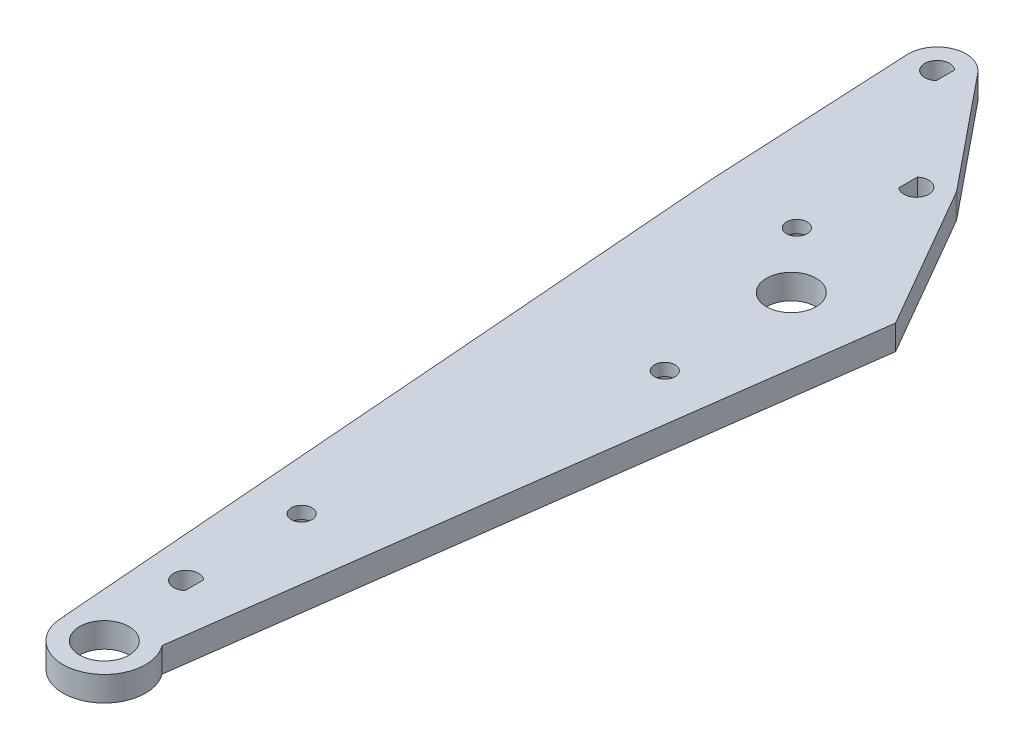
ISO-10303-21;
HEADER;
FILE_DESCRIPTION(('STEP AP214'),'2;1');
FILE_NAME('part.step','',(''),(''),'','','');
FILE_SCHEMA(('AUTOMOTIVE_DESIGN { 1 0 10303 214 1 1 1 1 }'));
ENDSEC;
DATA;
#1=APPLICATION_CONTEXT('core data for automotive mechanical design processes');
#2=APPLICATION_PROTOCOL_DEFINITION('international standard','automotive_design',2000,#1);
#3=PRODUCT_CONTEXT('',#1,'mechanical');
#4=PRODUCT('Part','Part','',(#3));
#5=PRODUCT_RELATED_PRODUCT_CATEGORY('part','',(#4));
#6=PRODUCT_DEFINITION_FORMATION('','',#4);
#7=PRODUCT_DEFINITION_CONTEXT('part definition',#1,'design');
#8=PRODUCT_DEFINITION('design','',#6,#7);
#9=PRODUCT_DEFINITION_SHAPE('','',#8);
#10=(LENGTH_UNIT() NAMED_UNIT(*) SI_UNIT(.MILLI.,.METRE.));
#11=(NAMED_UNIT(*) PLANE_ANGLE_UNIT() SI_UNIT($,.RADIAN.));
#12=(NAMED_UNIT(*) SI_UNIT($,.STERADIAN.) SOLID_ANGLE_UNIT());
#13=UNCERTAINTY_MEASURE_WITH_UNIT(LENGTH_MEASURE(1.E-05),#10,'distance_accuracy_value','');
#14=(GEOMETRIC_REPRESENTATION_CONTEXT(3) GLOBAL_UNCERTAINTY_ASSIGNED_CONTEXT((#13)) GLOBAL_UNIT_ASSIGNED_CONTEXT((#10,
#11,#12)) REPRESENTATION_CONTEXT('',''));
#15=CARTESIAN_POINT('',(0.,0.,0.));
#16=DIRECTION('',(0.,0.,1.));
#17=DIRECTION('',(1.,0.,0.));
#18=AXIS2_PLACEMENT_3D('',#15,#16,#17);
#19=CARTESIAN_POINT('',(-5.00000000000001,3.,75.));
#20=DIRECTION('',(0.,-1.,0.));
#21=DIRECTION('',(0.,0.,-1.));
#22=AXIS2_PLACEMENT_3D('',#19,#20,#21);
#23=CYLINDRICAL_SURFACE('',#22,1.25);
#24=CARTESIAN_POINT('',(-5.00000000000001,3.,75.));
#25=DIRECTION('',(0.,-1.,0.));
#26=DIRECTION('',(0.,0.,-1.));
#27=AXIS2_PLACEMENT_3D('',#24,#25,#26);
#28=CIRCLE('',#27,1.25);
#29=CARTESIAN_POINT('',(-5.00000000000001,3.,73.75));
#30=VERTEX_POINT('',#29);
#31=EDGE_CURVE('E389',#30,#30,#28,.T.);
#32=ORIENTED_EDGE('',*,*,#31,.F.);
#33=EDGE_LOOP('',(#32));
#34=FACE_BOUND('',#33,.T.);
#35=CARTESIAN_POINT('',(-5.00000000000001,1.5,75.));
#36=DIRECTION('',(0.,-1.,0.));
#37=DIRECTION('',(0.,0.,-1.));
#38=AXIS2_PLACEMENT_3D('',#35,#36,#37);
#39=CIRCLE('',#38,1.25);
#40=CARTESIAN_POINT('',(-5.00000000000001,1.5,73.75));
#41=VERTEX_POINT('',#40);
#42=EDGE_CURVE('E402',#41,#41,#39,.T.);
#43=ORIENTED_EDGE('',*,*,#42,.T.);
#44=EDGE_LOOP('',(#43));
#45=FACE_BOUND('',#44,.T.);
#46=ADVANCED_FACE('F40',(#34,#45),#23,.F.);
#47=CARTESIAN_POINT('',(2.,3.,38.));
#48=DIRECTION('',(0.,-1.,0.));
#49=DIRECTION('',(0.,0.,-1.));
#50=AXIS2_PLACEMENT_3D('',#47,#48,#49);
#51=CYLINDRICAL_SURFACE('',#50,1.25);
#52=CARTESIAN_POINT('',(2.,3.,38.));
#53=DIRECTION('',(0.,-1.,0.));
#54=DIRECTION('',(0.,0.,-1.));
#55=AXIS2_PLACEMENT_3D('',#52,#53,#54);
#56=CIRCLE('',#55,1.25);
#57=CARTESIAN_POINT('',(2.,3.,36.75));
#58=VERTEX_POINT('',#57);
#59=EDGE_CURVE('E392',#58,#58,#56,.T.);
#60=ORIENTED_EDGE('',*,*,#59,.F.);
#61=EDGE_LOOP('',(#60));
#62=FACE_BOUND('',#61,.T.);
#63=CARTESIAN_POINT('',(2.,1.5,38.));
#64=DIRECTION('',(0.,-1.,0.));
#65=DIRECTION('',(0.,0.,-1.));
#66=AXIS2_PLACEMENT_3D('',#63,#64,#65);
#67=CIRCLE('',#66,1.25);
#68=CARTESIAN_POINT('',(2.,1.5,36.75));
#69=VERTEX_POINT('',#68);
#70=EDGE_CURVE('E405',#69,#69,#67,.T.);
#71=ORIENTED_EDGE('',*,*,#70,.T.);
#72=EDGE_LOOP('',(#71));
#73=FACE_BOUND('',#72,.T.);
#74=ADVANCED_FACE('F321',(#62,#73),#51,.F.);
#75=CARTESIAN_POINT('',(-5.,3.,15.));
#76=DIRECTION('',(0.,-1.,0.));
#77=DIRECTION('',(0.,0.,-1.));
#78=AXIS2_PLACEMENT_3D('',#75,#76,#77);
#79=CYLINDRICAL_SURFACE('',#78,1.25);
#80=CARTESIAN_POINT('',(-5.,3.,15.));
#81=DIRECTION('',(0.,-1.,0.));
#82=DIRECTION('',(0.,0.,-1.));
#83=AXIS2_PLACEMENT_3D('',#80,#81,#82);
#84=CIRCLE('',#83,1.25);
#85=CARTESIAN_POINT('',(-5.,3.,13.75));
#86=VERTEX_POINT('',#85);
#87=EDGE_CURVE('E386',#86,#86,#84,.T.);
#88=ORIENTED_EDGE('',*,*,#87,.F.);
#89=EDGE_LOOP('',(#88));
#90=FACE_BOUND('',#89,.T.);
#91=CARTESIAN_POINT('',(-5.,1.5,15.));
#92=DIRECTION('',(0.,-1.,0.));
#93=DIRECTION('',(0.,0.,-1.));
#94=AXIS2_PLACEMENT_3D('',#91,#92,#93);
#95=CIRCLE('',#94,1.25);
#96=CARTESIAN_POINT('',(-5.,1.5,13.75));
#97=VERTEX_POINT('',#96);
#98=EDGE_CURVE('E414',#97,#97,#95,.T.);
#99=ORIENTED_EDGE('',*,*,#98,.T.);
#100=EDGE_LOOP('',(#99));
#101=FACE_BOUND('',#100,.T.);
#102=ADVANCED_FACE('F328',(#90,#101),#79,.F.);
#103=CARTESIAN_POINT('',(-5.00000000000001,3.,89.));
#104=DIRECTION('',(0.,-1.,0.));
#105=DIRECTION('',(0.,0.,-1.));
#106=AXIS2_PLACEMENT_3D('',#103,#104,#105);
#107=CYLINDRICAL_SURFACE('',#106,1.5);
#108=DIRECTION('',(0.,-1.,0.));
#109=VECTOR('',#108,1.);
#110=CARTESIAN_POINT('',(-4.00000000000001,35.5074876240748,90.1180339887499));
#111=LINE('',#110,#109);
#112=CARTESIAN_POINT('',(-4.00000000000001,3.,90.1180339887499));
#113=VERTEX_POINT('',#112);
#114=CARTESIAN_POINT('',(-4.00000000000001,0.,90.1180339887499));
#115=VERTEX_POINT('',#114);
#116=EDGE_CURVE('E151',#113,#115,#111,.T.);
#117=ORIENTED_EDGE('',*,*,#116,.T.);
#118=CARTESIAN_POINT('',(-5.00000000000001,0.,89.));
#119=DIRECTION('',(0.,-1.,0.));
#120=DIRECTION('',(0.,0.,-1.));
#121=AXIS2_PLACEMENT_3D('',#118,#119,#120);
#122=CIRCLE('',#121,1.5);
#123=CARTESIAN_POINT('',(-4.00000000000001,0.,87.8819660112501));
#124=VERTEX_POINT('',#123);
#125=EDGE_CURVE('E161',#115,#124,#122,.T.);
#126=ORIENTED_EDGE('',*,*,#125,.T.);
#127=DIRECTION('',(0.,-1.,0.));
#128=VECTOR('',#127,1.);
#129=CARTESIAN_POINT('',(-4.00000000000001,35.5074876240748,87.8819660112501));
#130=LINE('',#129,#128);
#131=CARTESIAN_POINT('',(-4.00000000000001,3.,87.8819660112501));
#132=VERTEX_POINT('',#131);
#133=EDGE_CURVE('E154',#132,#124,#130,.T.);
#134=ORIENTED_EDGE('',*,*,#133,.F.);
#135=CARTESIAN_POINT('',(-5.00000000000001,3.,89.));
#136=DIRECTION('',(0.,-1.,0.));
#137=DIRECTION('',(0.,0.,-1.));
#138=AXIS2_PLACEMENT_3D('',#135,#136,#137);
#139=CIRCLE('',#138,1.5);
#140=EDGE_CURVE('E162',#113,#132,#139,.T.);
#141=ORIENTED_EDGE('',*,*,#140,.F.);
#142=EDGE_LOOP('',(#117,#126,#134,#141));
#143=FACE_BOUND('',#142,.T.);
#144=ADVANCED_FACE('F160',(#143),#107,.F.);
#145=CARTESIAN_POINT('',(-13.,12.8994949366117,-10.));
#146=DIRECTION('',(0.,-1.,0.));
#147=DIRECTION('',(0.,0.,-1.));
#148=AXIS2_PLACEMENT_3D('',#145,#146,#147);
#149=CYLINDRICAL_SURFACE('',#148,3.5);
#150=CARTESIAN_POINT('',(-13.,0.,-10.));
#151=DIRECTION('',(0.,-1.,0.));
#152=DIRECTION('',(0.,0.,-1.));
#153=AXIS2_PLACEMENT_3D('',#150,#151,#152);
#154=CIRCLE('',#153,3.5);
#155=CARTESIAN_POINT('',(-16.4956537637557,0.,-9.82563038125682));
#156=VERTEX_POINT('',#155);
#157=CARTESIAN_POINT('',(-10.2846372796594,0.,-12.2083489980038));
#158=VERTEX_POINT('',#157);
#159=EDGE_CURVE('E64',#156,#158,#154,.T.);
#160=ORIENTED_EDGE('',*,*,#159,.F.);
#161=DIRECTION('',(0.,-1.,0.));
#162=VECTOR('',#161,1.);
#163=CARTESIAN_POINT('',(-16.4956537637557,35.5074876240748,-9.82563038125682));
#164=LINE('',#163,#162);
#165=CARTESIAN_POINT('',(-16.4956537637557,3.,-9.82563038125682));
#166=VERTEX_POINT('',#165);
#167=EDGE_CURVE('E240',#166,#156,#164,.T.);
#168=ORIENTED_EDGE('',*,*,#167,.F.);
#169=CARTESIAN_POINT('',(-13.,3.,-10.));
#170=DIRECTION('',(0.,1.,0.));
#171=DIRECTION('',(0.,0.,1.));
#172=AXIS2_PLACEMENT_3D('',#169,#170,#171);
#173=CIRCLE('',#172,3.5);
#174=CARTESIAN_POINT('',(-10.2846372796594,3.,-12.2083489980038));
#175=VERTEX_POINT('',#174);
#176=EDGE_CURVE('E44',#166,#175,#173,.F.);
#177=ORIENTED_EDGE('',*,*,#176,.T.);
#178=DIRECTION('',(0.,-1.,0.));
#179=VECTOR('',#178,1.);
#180=CARTESIAN_POINT('',(-10.2846372796594,35.5074876240748,-12.2083489980038));
#181=LINE('',#180,#179);
#182=EDGE_CURVE('E228',#175,#158,#181,.T.);
#183=ORIENTED_EDGE('',*,*,#182,.T.);
#184=EDGE_LOOP('',(#160,#168,#177,#183));
#185=FACE_BOUND('',#184,.T.);
#186=ADVANCED_FACE('F341',(#185),#149,.T.);
#187=CARTESIAN_POINT('',(-12.,12.8994949366117,0.));
#188=DIRECTION('',(-1.,0.,0.));
#189=DIRECTION('',(0.,0.,1.));
#190=AXIS2_PLACEMENT_3D('',#187,#188,#189);
#191=PLANE('',#190);
#192=DIRECTION('',(0.,-1.,0.));
#193=VECTOR('',#192,1.);
#194=CARTESIAN_POINT('',(-12.,12.8994949366117,-8.88196601125011));
#195=LINE('',#194,#193);
#196=CARTESIAN_POINT('',(-12.,3.,-8.88196601125011));
#197=VERTEX_POINT('',#196);
#198=CARTESIAN_POINT('',(-12.,0.,-8.88196601125011));
#199=VERTEX_POINT('',#198);
#200=EDGE_CURVE('E49',#197,#199,#195,.T.);
#201=ORIENTED_EDGE('',*,*,#200,.F.);
#202=DIRECTION('',(0.,0.,-1.));
#203=VECTOR('',#202,1.);
#204=CARTESIAN_POINT('',(-12.,3.,0.));
#205=LINE('',#204,#203);
#206=CARTESIAN_POINT('',(-12.,3.,-11.1180339887499));
#207=VERTEX_POINT('',#206);
#208=EDGE_CURVE('E256',#197,#207,#205,.T.);
#209=ORIENTED_EDGE('',*,*,#208,.T.);
#210=DIRECTION('',(0.,-1.,0.));
#211=VECTOR('',#210,1.);
#212=CARTESIAN_POINT('',(-12.,12.8994949366117,-11.1180339887499));
#213=LINE('',#212,#211);
#214=CARTESIAN_POINT('',(-12.,0.,-11.1180339887499));
#215=VERTEX_POINT('',#214);
#216=EDGE_CURVE('E11',#207,#215,#213,.T.);
#217=ORIENTED_EDGE('',*,*,#216,.T.);
#218=DIRECTION('',(0.,0.,-1.));
#219=VECTOR('',#218,1.);
#220=CARTESIAN_POINT('',(-12.,0.,0.));
#221=LINE('',#220,#219);
#222=EDGE_CURVE('E264',#199,#215,#221,.T.);
#223=ORIENTED_EDGE('',*,*,#222,.F.);
#224=EDGE_LOOP('',(#201,#209,#217,#223));
#225=FACE_BOUND('',#224,.T.);
#226=ADVANCED_FACE('F276',(#225),#191,.T.);
#227=CARTESIAN_POINT('',(-13.,12.8994949366117,-10.));
#228=DIRECTION('',(0.,-1.,0.));
#229=DIRECTION('',(0.,0.,-1.));
#230=AXIS2_PLACEMENT_3D('',#227,#228,#229);
#231=CYLINDRICAL_SURFACE('',#230,1.5);
#232=CARTESIAN_POINT('',(-13.,3.,-10.));
#233=DIRECTION('',(0.,1.,0.));
#234=DIRECTION('',(0.,0.,1.));
#235=AXIS2_PLACEMENT_3D('',#232,#233,#234);
#236=CIRCLE('',#235,1.5);
#237=EDGE_CURVE('E259',#197,#207,#236,.F.);
#238=ORIENTED_EDGE('',*,*,#237,.F.);
#239=ORIENTED_EDGE('',*,*,#200,.T.);
#240=CARTESIAN_POINT('',(-13.,0.,-10.));
#241=DIRECTION('',(0.,-1.,0.));
#242=DIRECTION('',(0.,0.,-1.));
#243=AXIS2_PLACEMENT_3D('',#240,#241,#242);
#244=CIRCLE('',#243,1.5);
#245=EDGE_CURVE('E261',#199,#215,#244,.T.);
#246=ORIENTED_EDGE('',*,*,#245,.T.);
#247=ORIENTED_EDGE('',*,*,#216,.F.);
#248=EDGE_LOOP('',(#238,#239,#246,#247));
#249=FACE_BOUND('',#248,.T.);
#250=ADVANCED_FACE('F42',(#249),#231,.F.);
#251=CARTESIAN_POINT('',(0.,0.,0.));
#252=DIRECTION('',(0.,-1.,0.));
#253=DIRECTION('',(0.,0.,-1.));
#254=AXIS2_PLACEMENT_3D('',#251,#252,#253);
#255=PLANE('',#254);
#256=CARTESIAN_POINT('',(-5.,0.,15.));
#257=DIRECTION('',(0.,-1.,0.));
#258=DIRECTION('',(0.,0.,-1.));
#259=AXIS2_PLACEMENT_3D('',#256,#257,#258);
#260=CIRCLE('',#259,2.00000000000001);
#261=CARTESIAN_POINT('',(-5.,0.,13.));
#262=VERTEX_POINT('',#261);
#263=EDGE_CURVE('E417',#262,#262,#260,.T.);
#264=ORIENTED_EDGE('',*,*,#263,.F.);
#265=EDGE_LOOP('',(#264));
#266=FACE_BOUND('',#265,.T.);
#267=CARTESIAN_POINT('',(2.,0.,38.));
#268=DIRECTION('',(0.,-1.,0.));
#269=DIRECTION('',(0.,0.,-1.));
#270=AXIS2_PLACEMENT_3D('',#267,#268,#269);
#271=CIRCLE('',#270,2.);
#272=CARTESIAN_POINT('',(2.,0.,36.));
#273=VERTEX_POINT('',#272);
#274=EDGE_CURVE('E408',#273,#273,#271,.T.);
#275=ORIENTED_EDGE('',*,*,#274,.F.);
#276=EDGE_LOOP('',(#275));
#277=FACE_BOUND('',#276,.T.);
#278=CARTESIAN_POINT('',(-5.00000000000001,0.,75.));
#279=DIRECTION('',(0.,-1.,0.));
#280=DIRECTION('',(0.,0.,-1.));
#281=AXIS2_PLACEMENT_3D('',#278,#279,#280);
#282=CIRCLE('',#281,2.);
#283=CARTESIAN_POINT('',(-5.00000000000001,0.,73.));
#284=VERTEX_POINT('',#283);
#285=EDGE_CURVE('E398',#284,#284,#282,.T.);
#286=ORIENTED_EDGE('',*,*,#285,.F.);
#287=EDGE_LOOP('',(#286));
#288=FACE_BOUND('',#287,.T.);
#289=ORIENTED_EDGE('',*,*,#245,.F.);
#290=ORIENTED_EDGE('',*,*,#222,.T.);
#291=EDGE_LOOP('',(#289,#290));
#292=FACE_BOUND('',#291,.T.);
#293=ORIENTED_EDGE('',*,*,#159,.T.);
#294=DIRECTION('',(-0.630956856572518,0.,-0.775817920097317));
#295=VECTOR('',#294,1.);
#296=CARTESIAN_POINT('',(-0.214175705160721,0.,0.174184723221474));
#297=LINE('',#296,#295);
#298=CARTESIAN_POINT('',(0.694636778176915,0.,1.29165100199619));
#299=VERTEX_POINT('',#298);
#300=EDGE_CURVE('E241',#299,#158,#297,.T.);
#301=ORIENTED_EDGE('',*,*,#300,.F.);
#302=CARTESIAN_POINT('',(-2.02072594216369,0.,3.5));
#303=DIRECTION('',(0.,1.,0.));
#304=DIRECTION('',(0.,0.,1.));
#305=AXIS2_PLACEMENT_3D('',#302,#303,#304);
#306=CIRCLE('',#305,3.5);
#307=CARTESIAN_POINT('',(1.01036297108185,0.,1.75000000000001));
#308=VERTEX_POINT('',#307);
#309=EDGE_CURVE('E208',#308,#299,#306,.T.);
#310=ORIENTED_EDGE('',*,*,#309,.F.);
#311=DIRECTION('',(0.499999999999998,0.,0.86602540378444));
#312=VECTOR('',#311,1.);
#313=CARTESIAN_POINT('',(0.,0.,0.));
#314=LINE('',#313,#312);
#315=CARTESIAN_POINT('',(10.9792740578363,0.,19.0166604983955));
#316=VERTEX_POINT('',#315);
#317=EDGE_CURVE('E205',#308,#316,#314,.T.);
#318=ORIENTED_EDGE('',*,*,#317,.T.);
#319=DIRECTION('',(0.134133468348585,0.,-0.990963275136258));
#320=VECTOR('',#319,1.);
#321=CARTESIAN_POINT('',(13.3094573106285,0.,1.80152354351028));
#322=LINE('',#321,#320);
#323=CARTESIAN_POINT('',(0.38428686699731,0.,97.2912577031378));
#324=VERTEX_POINT('',#323);
#325=EDGE_CURVE('E371',#324,#316,#322,.T.);
#326=ORIENTED_EDGE('',*,*,#325,.F.);
#327=CARTESIAN_POINT('',(-3.61571313300269,0.,100.291257703138));
#328=DIRECTION('',(0.,1.,0.));
#329=DIRECTION('',(0.,0.,1.));
#330=AXIS2_PLACEMENT_3D('',#327,#328,#329);
#331=CIRCLE('',#330,5.00000000000001);
#332=CARTESIAN_POINT('',(-8.61301010974704,0.,100.126871188418));
#333=VERTEX_POINT('',#332);
#334=EDGE_CURVE('E216',#333,#324,#331,.T.);
#335=ORIENTED_EDGE('',*,*,#334,.F.);
#336=DIRECTION('',(-0.999459395348868,0.,-0.0328773029440681));
#337=VECTOR('',#336,1.);
#338=CARTESIAN_POINT('',(-3.29943180912356,0.,100.301661804544));
#339=LINE('',#338,#337);
#340=CARTESIAN_POINT('',(-8.64369988169605,0.,100.125861645724));
#341=VERTEX_POINT('',#340);
#342=EDGE_CURVE('E213',#333,#341,#339,.T.);
#343=ORIENTED_EDGE('',*,*,#342,.T.);
#344=DIRECTION('',(-0.0775829185283547,0.,-0.996985902985906));
#345=VECTOR('',#344,1.);
#346=CARTESIAN_POINT('',(-16.3363153983453,0.,1.27125069954098));
#347=LINE('',#346,#345);
#348=CARTESIAN_POINT('',(-15.2382479566062,0.,15.3820598919224));
#349=VERTEX_POINT('',#348);
#350=EDGE_CURVE('E210',#341,#349,#347,.T.);
#351=ORIENTED_EDGE('',*,*,#350,.T.);
#352=DIRECTION('',(0.0498198910694797,0.,0.998758218215913));
#353=VECTOR('',#352,1.);
#354=CARTESIAN_POINT('',(-15.9658072272928,0.,0.796403736552868));
#355=LINE('',#354,#353);
#356=EDGE_CURVE('E236',#156,#349,#355,.T.);
#357=ORIENTED_EDGE('',*,*,#356,.F.);
#358=EDGE_LOOP('',(#293,#301,#310,#318,#326,#335,#343,#351,#357));
#359=FACE_BOUND('',#358,.T.);
#360=CARTESIAN_POINT('',(-2.02072594216369,0.,3.5));
#361=DIRECTION('',(0.,1.,0.));
#362=DIRECTION('',(0.,0.,1.));
#363=AXIS2_PLACEMENT_3D('',#360,#361,#362);
#364=CIRCLE('',#363,1.5);
#365=CARTESIAN_POINT('',(-3.02072594216369,0.,4.61803398874989));
#366=VERTEX_POINT('',#365);
#367=CARTESIAN_POINT('',(-3.02072594216369,0.,2.38196601125011));
#368=VERTEX_POINT('',#367);
#369=EDGE_CURVE('E218',#366,#368,#364,.T.);
#370=ORIENTED_EDGE('',*,*,#369,.T.);
#371=DIRECTION('',(0.,0.,1.));
#372=VECTOR('',#371,1.);
#373=CARTESIAN_POINT('',(-3.02072594216369,0.,0.));
#374=LINE('',#373,#372);
#375=EDGE_CURVE('E177',#368,#366,#374,.T.);
#376=ORIENTED_EDGE('',*,*,#375,.T.);
#377=EDGE_LOOP('',(#370,#376));
#378=FACE_BOUND('',#377,.T.);
#379=CARTESIAN_POINT('',(1.45106142559597,0.,22.1249785734088));
#380=DIRECTION('',(0.,1.,0.));
#381=DIRECTION('',(0.,0.,1.));
#382=AXIS2_PLACEMENT_3D('',#379,#380,#381);
#383=CIRCLE('',#382,3.);
#384=CARTESIAN_POINT('',(1.45106142559597,0.,25.1249785734088));
#385=VERTEX_POINT('',#384);
#386=EDGE_CURVE('E202',#385,#385,#383,.T.);
#387=ORIENTED_EDGE('',*,*,#386,.T.);
#388=EDGE_LOOP('',(#387));
#389=FACE_BOUND('',#388,.T.);
#390=CARTESIAN_POINT('',(-3.61571313300269,0.,100.291257703138));
#391=DIRECTION('',(0.,1.,0.));
#392=DIRECTION('',(0.,0.,1.));
#393=AXIS2_PLACEMENT_3D('',#390,#391,#392);
#394=CIRCLE('',#393,3.);
#395=CARTESIAN_POINT('',(-3.61571313300269,0.,103.291257703138));
#396=VERTEX_POINT('',#395);
#397=EDGE_CURVE('E167',#396,#396,#394,.T.);
#398=ORIENTED_EDGE('',*,*,#397,.T.);
#399=EDGE_LOOP('',(#398));
#400=FACE_BOUND('',#399,.T.);
#401=ORIENTED_EDGE('',*,*,#125,.F.);
#402=DIRECTION('',(0.,0.,1.));
#403=VECTOR('',#402,1.);
#404=CARTESIAN_POINT('',(-4.00000000000001,0.,0.));
#405=LINE('',#404,#403);
#406=EDGE_CURVE('E148',#124,#115,#405,.T.);
#407=ORIENTED_EDGE('',*,*,#406,.F.);
#408=EDGE_LOOP('',(#401,#407));
#409=FACE_BOUND('',#408,.T.);
#410=ADVANCED_FACE('F164',(#266,#277,#288,#292,#359,#378,#389,#400,#409),#255,.T.);
#411=CARTESIAN_POINT('',(0.,3.,0.));
#412=DIRECTION('',(0.,1.,0.));
#413=DIRECTION('',(0.,0.,1.));
#414=AXIS2_PLACEMENT_3D('',#411,#412,#413);
#415=PLANE('',#414);
#416=ORIENTED_EDGE('',*,*,#87,.T.);
#417=EDGE_LOOP('',(#416));
#418=FACE_BOUND('',#417,.T.);
#419=ORIENTED_EDGE('',*,*,#59,.T.);
#420=EDGE_LOOP('',(#419));
#421=FACE_BOUND('',#420,.T.);
#422=ORIENTED_EDGE('',*,*,#31,.T.);
#423=EDGE_LOOP('',(#422));
#424=FACE_BOUND('',#423,.T.);
#425=ORIENTED_EDGE('',*,*,#176,.F.);
#426=DIRECTION('',(0.0498198910694797,0.,0.998758218215913));
#427=VECTOR('',#426,1.);
#428=CARTESIAN_POINT('',(-15.9658072272928,3.,0.796403736552868));
#429=LINE('',#428,#427);
#430=CARTESIAN_POINT('',(-15.2382479566062,3.,15.3820598919224));
#431=VERTEX_POINT('',#430);
#432=EDGE_CURVE('E246',#166,#431,#429,.T.);
#433=ORIENTED_EDGE('',*,*,#432,.T.);
#434=DIRECTION('',(-0.0775829185283547,0.,-0.996985902985906));
#435=VECTOR('',#434,1.);
#436=CARTESIAN_POINT('',(-16.3363153983453,3.,1.27125069954098));
#437=LINE('',#436,#435);
#438=CARTESIAN_POINT('',(-8.64369988169605,3.,100.125861645724));
#439=VERTEX_POINT('',#438);
#440=EDGE_CURVE('E186',#439,#431,#437,.T.);
#441=ORIENTED_EDGE('',*,*,#440,.F.);
#442=DIRECTION('',(-0.999459395348868,0.,-0.0328773029440681));
#443=VECTOR('',#442,1.);
#444=CARTESIAN_POINT('',(-3.29943180912356,3.,100.301661804544));
#445=LINE('',#444,#443);
#446=CARTESIAN_POINT('',(-8.61301010974704,3.,100.126871188418));
#447=VERTEX_POINT('',#446);
#448=EDGE_CURVE('E188',#447,#439,#445,.T.);
#449=ORIENTED_EDGE('',*,*,#448,.F.);
#450=CARTESIAN_POINT('',(-3.61571313300269,3.,100.291257703138));
#451=DIRECTION('',(0.,1.,0.));
#452=DIRECTION('',(0.,0.,1.));
#453=AXIS2_PLACEMENT_3D('',#450,#451,#452);
#454=CIRCLE('',#453,5.00000000000001);
#455=CARTESIAN_POINT('',(0.38428686699731,3.,97.2912577031378));
#456=VERTEX_POINT('',#455);
#457=EDGE_CURVE('E191',#447,#456,#454,.T.);
#458=ORIENTED_EDGE('',*,*,#457,.T.);
#459=DIRECTION('',(0.134133468348585,0.,-0.990963275136258));
#460=VECTOR('',#459,1.);
#461=CARTESIAN_POINT('',(13.3094573106285,3.,1.80152354351028));
#462=LINE('',#461,#460);
#463=CARTESIAN_POINT('',(10.9792740578363,3.,19.0166604983955));
#464=VERTEX_POINT('',#463);
#465=EDGE_CURVE('E170',#456,#464,#462,.T.);
#466=ORIENTED_EDGE('',*,*,#465,.T.);
#467=DIRECTION('',(0.499999999999998,0.,0.86602540378444));
#468=VECTOR('',#467,1.);
#469=CARTESIAN_POINT('',(0.,3.,0.));
#470=LINE('',#469,#468);
#471=CARTESIAN_POINT('',(1.01036297108185,3.,1.75000000000001));
#472=VERTEX_POINT('',#471);
#473=EDGE_CURVE('E180',#472,#464,#470,.T.);
#474=ORIENTED_EDGE('',*,*,#473,.F.);
#475=CARTESIAN_POINT('',(-2.02072594216369,3.,3.5));
#476=DIRECTION('',(0.,1.,0.));
#477=DIRECTION('',(0.,0.,1.));
#478=AXIS2_PLACEMENT_3D('',#475,#476,#477);
#479=CIRCLE('',#478,3.5);
#480=CARTESIAN_POINT('',(0.694636778176915,3.,1.29165100199619));
#481=VERTEX_POINT('',#480);
#482=EDGE_CURVE('E183',#472,#481,#479,.T.);
#483=ORIENTED_EDGE('',*,*,#482,.T.);
#484=DIRECTION('',(-0.630956856572518,0.,-0.775817920097317));
#485=VECTOR('',#484,1.);
#486=CARTESIAN_POINT('',(-0.214175705160721,3.,0.174184723221474));
#487=LINE('',#486,#485);
#488=EDGE_CURVE('E244',#481,#175,#487,.T.);
#489=ORIENTED_EDGE('',*,*,#488,.T.);
#490=EDGE_LOOP('',(#425,#433,#441,#449,#458,#466,#474,#483,#489));
#491=FACE_BOUND('',#490,.T.);
#492=ORIENTED_EDGE('',*,*,#208,.F.);
#493=ORIENTED_EDGE('',*,*,#237,.T.);
#494=EDGE_LOOP('',(#492,#493));
#495=FACE_BOUND('',#494,.T.);
#496=ORIENTED_EDGE('',*,*,#140,.T.);
#497=DIRECTION('',(0.,0.,1.));
#498=VECTOR('',#497,1.);
#499=CARTESIAN_POINT('',(-4.00000000000001,3.,0.));
#500=LINE('',#499,#498);
#501=EDGE_CURVE('E56',#132,#113,#500,.T.);
#502=ORIENTED_EDGE('',*,*,#501,.T.);
#503=EDGE_LOOP('',(#496,#502));
#504=FACE_BOUND('',#503,.T.);
#505=CARTESIAN_POINT('',(-3.61571313300269,3.,100.291257703138));
#506=DIRECTION('',(0.,1.,0.));
#507=DIRECTION('',(0.,0.,1.));
#508=AXIS2_PLACEMENT_3D('',#505,#506,#507);
#509=CIRCLE('',#508,3.);
#510=CARTESIAN_POINT('',(-3.61571313300269,3.,103.291257703138));
#511=VERTEX_POINT('',#510);
#512=EDGE_CURVE('E173',#511,#511,#509,.T.);
#513=ORIENTED_EDGE('',*,*,#512,.F.);
#514=EDGE_LOOP('',(#513));
#515=FACE_BOUND('',#514,.T.);
#516=CARTESIAN_POINT('',(1.45106142559597,3.,22.1249785734088));
#517=DIRECTION('',(0.,1.,0.));
#518=DIRECTION('',(0.,0.,1.));
#519=AXIS2_PLACEMENT_3D('',#516,#517,#518);
#520=CIRCLE('',#519,3.);
#521=CARTESIAN_POINT('',(1.45106142559597,3.,25.1249785734088));
#522=VERTEX_POINT('',#521);
#523=EDGE_CURVE('E176',#522,#522,#520,.T.);
#524=ORIENTED_EDGE('',*,*,#523,.F.);
#525=EDGE_LOOP('',(#524));
#526=FACE_BOUND('',#525,.T.);
#527=CARTESIAN_POINT('',(-2.02072594216369,3.,3.5));
#528=DIRECTION('',(0.,1.,0.));
#529=DIRECTION('',(0.,0.,1.));
#530=AXIS2_PLACEMENT_3D('',#527,#528,#529);
#531=CIRCLE('',#530,1.5);
#532=CARTESIAN_POINT('',(-3.02072594216369,3.,4.61803398874989));
#533=VERTEX_POINT('',#532);
#534=CARTESIAN_POINT('',(-3.02072594216369,3.,2.38196601125011));
#535=VERTEX_POINT('',#534);
#536=EDGE_CURVE('E193',#533,#535,#531,.T.);
#537=ORIENTED_EDGE('',*,*,#536,.F.);
#538=DIRECTION('',(0.,0.,1.));
#539=VECTOR('',#538,1.);
#540=CARTESIAN_POINT('',(-3.02072594216369,3.,0.));
#541=LINE('',#540,#539);
#542=EDGE_CURVE('E196',#535,#533,#541,.T.);
#543=ORIENTED_EDGE('',*,*,#542,.F.);
#544=EDGE_LOOP('',(#537,#543));
#545=FACE_BOUND('',#544,.T.);
#546=ADVANCED_FACE('F278',(#418,#421,#424,#491,#495,#504,#515,#526,#545),#415,.T.);
#547=CARTESIAN_POINT('',(-15.9658072272928,35.5074876240748,0.796403736552868));
#548=DIRECTION('',(0.998758218215913,0.,-0.0498198910694797));
#549=DIRECTION('',(-0.0498198910694797,0.,-0.998758218215913));
#550=AXIS2_PLACEMENT_3D('',#547,#548,#549);
#551=PLANE('',#550);
#552=ORIENTED_EDGE('',*,*,#432,.F.);
#553=ORIENTED_EDGE('',*,*,#167,.T.);
#554=ORIENTED_EDGE('',*,*,#356,.T.);
#555=DIRECTION('',(0.,-1.,0.));
#556=VECTOR('',#555,1.);
#557=CARTESIAN_POINT('',(-15.2382479566062,35.5074876240748,15.3820598919224));
#558=LINE('',#557,#556);
#559=EDGE_CURVE('E239',#431,#349,#558,.T.);
#560=ORIENTED_EDGE('',*,*,#559,.F.);
#561=EDGE_LOOP('',(#552,#553,#554,#560));
#562=FACE_BOUND('',#561,.T.);
#563=ADVANCED_FACE('F280',(#562),#551,.F.);
#564=CARTESIAN_POINT('',(-0.214175705160721,35.5074876240748,0.174184723221474));
#565=DIRECTION('',(-0.775817920097317,0.,0.630956856572518));
#566=DIRECTION('',(0.630956856572518,0.,0.775817920097317));
#567=AXIS2_PLACEMENT_3D('',#564,#565,#566);
#568=PLANE('',#567);
#569=ORIENTED_EDGE('',*,*,#488,.F.);
#570=DIRECTION('',(0.,-1.,0.));
#571=VECTOR('',#570,1.);
#572=CARTESIAN_POINT('',(0.694636778176915,35.5074876240748,1.29165100199619));
#573=LINE('',#572,#571);
#574=EDGE_CURVE('E245',#481,#299,#573,.T.);
#575=ORIENTED_EDGE('',*,*,#574,.T.);
#576=ORIENTED_EDGE('',*,*,#300,.T.);
#577=ORIENTED_EDGE('',*,*,#182,.F.);
#578=EDGE_LOOP('',(#569,#575,#576,#577));
#579=FACE_BOUND('',#578,.T.);
#580=ADVANCED_FACE('F360',(#579),#568,.F.);
#581=CARTESIAN_POINT('',(-2.02072594216369,3.,3.5));
#582=DIRECTION('',(0.,-1.,0.));
#583=DIRECTION('',(0.,0.,-1.));
#584=AXIS2_PLACEMENT_3D('',#581,#582,#583);
#585=CYLINDRICAL_SURFACE('',#584,3.5);
#586=ORIENTED_EDGE('',*,*,#309,.T.);
#587=ORIENTED_EDGE('',*,*,#574,.F.);
#588=ORIENTED_EDGE('',*,*,#482,.F.);
#589=DIRECTION('',(0.,-1.,0.));
#590=VECTOR('',#589,1.);
#591=CARTESIAN_POINT('',(1.01036297108185,3.,1.75000000000001));
#592=LINE('',#591,#590);
#593=EDGE_CURVE('E226',#472,#308,#592,.T.);
#594=ORIENTED_EDGE('',*,*,#593,.T.);
#595=EDGE_LOOP('',(#586,#587,#588,#594));
#596=FACE_BOUND('',#595,.T.);
#597=ADVANCED_FACE('F346',(#596),#585,.T.);
#598=CARTESIAN_POINT('',(-2.02072594216369,3.,3.5));
#599=DIRECTION('',(0.,-1.,0.));
#600=DIRECTION('',(0.,0.,-1.));
#601=AXIS2_PLACEMENT_3D('',#598,#599,#600);
#602=CYLINDRICAL_SURFACE('',#601,1.5);
#603=ORIENTED_EDGE('',*,*,#369,.F.);
#604=DIRECTION('',(0.,-1.,0.));
#605=VECTOR('',#604,1.);
#606=CARTESIAN_POINT('',(-3.02072594216369,3.,4.61803398874989));
#607=LINE('',#606,#605);
#608=EDGE_CURVE('E225',#533,#366,#607,.T.);
#609=ORIENTED_EDGE('',*,*,#608,.F.);
#610=ORIENTED_EDGE('',*,*,#536,.T.);
#611=DIRECTION('',(0.,-1.,0.));
#612=VECTOR('',#611,1.);
#613=CARTESIAN_POINT('',(-3.02072594216369,3.,2.38196601125011));
#614=LINE('',#613,#612);
#615=EDGE_CURVE('E223',#535,#368,#614,.T.);
#616=ORIENTED_EDGE('',*,*,#615,.T.);
#617=EDGE_LOOP('',(#603,#609,#610,#616));
#618=FACE_BOUND('',#617,.T.);
#619=ADVANCED_FACE('F295',(#618),#602,.F.);
#620=CARTESIAN_POINT('',(0.,3.,0.));
#621=DIRECTION('',(0.86602540378444,0.,-0.499999999999998));
#622=DIRECTION('',(-0.499999999999998,0.,-0.86602540378444));
#623=AXIS2_PLACEMENT_3D('',#620,#621,#622);
#624=PLANE('',#623);
#625=ORIENTED_EDGE('',*,*,#317,.F.);
#626=ORIENTED_EDGE('',*,*,#593,.F.);
#627=ORIENTED_EDGE('',*,*,#473,.T.);
#628=DIRECTION('',(0.,-1.,0.));
#629=VECTOR('',#628,1.);
#630=CARTESIAN_POINT('',(10.9792740578363,3.,19.0166604983955));
#631=LINE('',#630,#629);
#632=EDGE_CURVE('E199',#464,#316,#631,.T.);
#633=ORIENTED_EDGE('',*,*,#632,.T.);
#634=EDGE_LOOP('',(#625,#626,#627,#633));
#635=FACE_BOUND('',#634,.T.);
#636=ADVANCED_FACE('F345',(#635),#624,.T.);
#637=CARTESIAN_POINT('',(-16.3363153983453,3.,1.27125069954098));
#638=DIRECTION('',(-0.996985902985906,0.,0.0775829185283547));
#639=DIRECTION('',(0.0775829185283547,0.,0.996985902985906));
#640=AXIS2_PLACEMENT_3D('',#637,#638,#639);
#641=PLANE('',#640);
#642=ORIENTED_EDGE('',*,*,#350,.F.);
#643=DIRECTION('',(0.,-1.,0.));
#644=VECTOR('',#643,1.);
#645=CARTESIAN_POINT('',(-8.64369988169605,3.,100.125861645724));
#646=LINE('',#645,#644);
#647=EDGE_CURVE('E233',#439,#341,#646,.T.);
#648=ORIENTED_EDGE('',*,*,#647,.F.);
#649=ORIENTED_EDGE('',*,*,#440,.T.);
#650=ORIENTED_EDGE('',*,*,#559,.T.);
#651=EDGE_LOOP('',(#642,#648,#649,#650));
#652=FACE_BOUND('',#651,.T.);
#653=ADVANCED_FACE('F350',(#652),#641,.T.);
#654=CARTESIAN_POINT('',(-3.29943180912356,3.,100.301661804544));
#655=DIRECTION('',(-0.032877302944068,0.,0.999459395348868));
#656=DIRECTION('',(0.999459395348868,0.,0.0328773029440681));
#657=AXIS2_PLACEMENT_3D('',#654,#655,#656);
#658=PLANE('',#657);
#659=ORIENTED_EDGE('',*,*,#342,.F.);
#660=DIRECTION('',(0.,-1.,0.));
#661=VECTOR('',#660,1.);
#662=CARTESIAN_POINT('',(-8.61301010974704,3.,100.126871188418));
#663=LINE('',#662,#661);
#664=EDGE_CURVE('E231',#447,#333,#663,.T.);
#665=ORIENTED_EDGE('',*,*,#664,.F.);
#666=ORIENTED_EDGE('',*,*,#448,.T.);
#667=ORIENTED_EDGE('',*,*,#647,.T.);
#668=EDGE_LOOP('',(#659,#665,#666,#667));
#669=FACE_BOUND('',#668,.T.);
#670=ADVANCED_FACE('F347',(#669),#658,.T.);
#671=CARTESIAN_POINT('',(-3.61571313300269,3.,100.291257703138));
#672=DIRECTION('',(0.,-1.,0.));
#673=DIRECTION('',(0.,0.,-1.));
#674=AXIS2_PLACEMENT_3D('',#671,#672,#673);
#675=CYLINDRICAL_SURFACE('',#674,5.00000000000001);
#676=ORIENTED_EDGE('',*,*,#334,.T.);
#677=DIRECTION('',(0.,-1.,0.));
#678=VECTOR('',#677,1.);
#679=CARTESIAN_POINT('',(0.38428686699731,3.,97.2912577031378));
#680=LINE('',#679,#678);
#681=EDGE_CURVE('E165',#456,#324,#680,.T.);
#682=ORIENTED_EDGE('',*,*,#681,.F.);
#683=ORIENTED_EDGE('',*,*,#457,.F.);
#684=ORIENTED_EDGE('',*,*,#664,.T.);
#685=EDGE_LOOP('',(#676,#682,#683,#684));
#686=FACE_BOUND('',#685,.T.);
#687=ADVANCED_FACE('F316',(#686),#675,.T.);
#688=CARTESIAN_POINT('',(1.45106142559597,3.,22.1249785734088));
#689=DIRECTION('',(0.,-1.,0.));
#690=DIRECTION('',(0.,0.,-1.));
#691=AXIS2_PLACEMENT_3D('',#688,#689,#690);
#692=CYLINDRICAL_SURFACE('',#691,3.);
#693=ORIENTED_EDGE('',*,*,#523,.T.);
#694=EDGE_LOOP('',(#693));
#695=FACE_BOUND('',#694,.T.);
#696=ORIENTED_EDGE('',*,*,#386,.F.);
#697=EDGE_LOOP('',(#696));
#698=FACE_BOUND('',#697,.T.);
#699=ADVANCED_FACE('F307',(#695,#698),#692,.F.);
#700=CARTESIAN_POINT('',(-3.61571313300269,3.,100.291257703138));
#701=DIRECTION('',(0.,-1.,0.));
#702=DIRECTION('',(0.,0.,-1.));
#703=AXIS2_PLACEMENT_3D('',#700,#701,#702);
#704=CYLINDRICAL_SURFACE('',#703,3.);
#705=ORIENTED_EDGE('',*,*,#512,.T.);
#706=EDGE_LOOP('',(#705));
#707=FACE_BOUND('',#706,.T.);
#708=ORIENTED_EDGE('',*,*,#397,.F.);
#709=EDGE_LOOP('',(#708));
#710=FACE_BOUND('',#709,.T.);
#711=ADVANCED_FACE('F305',(#707,#710),#704,.F.);
#712=CARTESIAN_POINT('',(-3.02072594216369,3.,0.));
#713=DIRECTION('',(1.,0.,0.));
#714=DIRECTION('',(0.,0.,-1.));
#715=AXIS2_PLACEMENT_3D('',#712,#713,#714);
#716=PLANE('',#715);
#717=ORIENTED_EDGE('',*,*,#375,.F.);
#718=ORIENTED_EDGE('',*,*,#615,.F.);
#719=ORIENTED_EDGE('',*,*,#542,.T.);
#720=ORIENTED_EDGE('',*,*,#608,.T.);
#721=EDGE_LOOP('',(#717,#718,#719,#720));
#722=FACE_BOUND('',#721,.T.);
#723=ADVANCED_FACE('F293',(#722),#716,.T.);
#724=CARTESIAN_POINT('',(13.3094573106285,3.,1.80152354351028));
#725=DIRECTION('',(-0.990963275136258,0.,-0.134133468348585));
#726=DIRECTION('',(-0.134133468348585,0.,0.990963275136258));
#727=AXIS2_PLACEMENT_3D('',#724,#725,#726);
#728=PLANE('',#727);
#729=ORIENTED_EDGE('',*,*,#325,.T.);
#730=ORIENTED_EDGE('',*,*,#632,.F.);
#731=ORIENTED_EDGE('',*,*,#465,.F.);
#732=ORIENTED_EDGE('',*,*,#681,.T.);
#733=EDGE_LOOP('',(#729,#730,#731,#732));
#734=FACE_BOUND('',#733,.T.);
#735=ADVANCED_FACE('F314',(#734),#728,.F.);
#736=CARTESIAN_POINT('',(-4.00000000000001,35.5074876240748,0.));
#737=DIRECTION('',(1.,0.,0.));
#738=DIRECTION('',(0.,0.,-1.));
#739=AXIS2_PLACEMENT_3D('',#736,#737,#738);
#740=PLANE('',#739);
#741=ORIENTED_EDGE('',*,*,#501,.F.);
#742=ORIENTED_EDGE('',*,*,#133,.T.);
#743=ORIENTED_EDGE('',*,*,#406,.T.);
#744=ORIENTED_EDGE('',*,*,#116,.F.);
#745=EDGE_LOOP('',(#741,#742,#743,#744));
#746=FACE_BOUND('',#745,.T.);
#747=ADVANCED_FACE('F150',(#746),#740,.F.);
#748=CARTESIAN_POINT('',(-5.,1.5,15.));
#749=DIRECTION('',(0.,-1.,0.));
#750=DIRECTION('',(0.,0.,-1.));
#751=AXIS2_PLACEMENT_3D('',#748,#749,#750);
#752=CYLINDRICAL_SURFACE('',#751,2.00000000000001);
#753=CARTESIAN_POINT('',(-5.,1.5,15.));
#754=DIRECTION('',(0.,-1.,0.));
#755=DIRECTION('',(0.,0.,-1.));
#756=AXIS2_PLACEMENT_3D('',#753,#754,#755);
#757=CIRCLE('',#756,2.00000000000001);
#758=CARTESIAN_POINT('',(-5.,1.5,13.));
#759=VERTEX_POINT('',#758);
#760=EDGE_CURVE('E393',#759,#759,#757,.T.);
#761=ORIENTED_EDGE('',*,*,#760,.F.);
#762=EDGE_LOOP('',(#761));
#763=FACE_BOUND('',#762,.T.);
#764=ORIENTED_EDGE('',*,*,#263,.T.);
#765=EDGE_LOOP('',(#764));
#766=FACE_BOUND('',#765,.T.);
#767=ADVANCED_FACE('F336',(#763,#766),#752,.F.);
#768=CARTESIAN_POINT('',(-5.,1.5,15.));
#769=DIRECTION('',(0.,-1.,0.));
#770=DIRECTION('',(0.,0.,-1.));
#771=AXIS2_PLACEMENT_3D('',#768,#769,#770);
#772=PLANE('',#771);
#773=ORIENTED_EDGE('',*,*,#98,.F.);
#774=EDGE_LOOP('',(#773));
#775=FACE_BOUND('',#774,.T.);
#776=ORIENTED_EDGE('',*,*,#760,.T.);
#777=EDGE_LOOP('',(#776));
#778=FACE_BOUND('',#777,.T.);
#779=ADVANCED_FACE('F426',(#775,#778),#772,.T.);
#780=CARTESIAN_POINT('',(2.,1.5,38.));
#781=DIRECTION('',(0.,-1.,0.));
#782=DIRECTION('',(0.,0.,-1.));
#783=AXIS2_PLACEMENT_3D('',#780,#781,#782);
#784=CYLINDRICAL_SURFACE('',#783,2.);
#785=CARTESIAN_POINT('',(2.,1.5,38.));
#786=DIRECTION('',(0.,-1.,0.));
#787=DIRECTION('',(0.,0.,-1.));
#788=AXIS2_PLACEMENT_3D('',#785,#786,#787);
#789=CIRCLE('',#788,2.);
#790=CARTESIAN_POINT('',(2.,1.5,36.));
#791=VERTEX_POINT('',#790);
#792=EDGE_CURVE('E411',#791,#791,#789,.T.);
#793=ORIENTED_EDGE('',*,*,#792,.F.);
#794=EDGE_LOOP('',(#793));
#795=FACE_BOUND('',#794,.T.);
#796=ORIENTED_EDGE('',*,*,#274,.T.);
#797=EDGE_LOOP('',(#796));
#798=FACE_BOUND('',#797,.T.);
#799=ADVANCED_FACE('F429',(#795,#798),#784,.F.);
#800=CARTESIAN_POINT('',(2.,1.5,38.));
#801=DIRECTION('',(0.,-1.,0.));
#802=DIRECTION('',(0.,0.,-1.));
#803=AXIS2_PLACEMENT_3D('',#800,#801,#802);
#804=PLANE('',#803);
#805=ORIENTED_EDGE('',*,*,#70,.F.);
#806=EDGE_LOOP('',(#805));
#807=FACE_BOUND('',#806,.T.);
#808=ORIENTED_EDGE('',*,*,#792,.T.);
#809=EDGE_LOOP('',(#808));
#810=FACE_BOUND('',#809,.T.);
#811=ADVANCED_FACE('F445',(#807,#810),#804,.T.);
#812=CARTESIAN_POINT('',(-5.00000000000001,1.5,75.));
#813=DIRECTION('',(0.,-1.,0.));
#814=DIRECTION('',(0.,0.,-1.));
#815=AXIS2_PLACEMENT_3D('',#812,#813,#814);
#816=CYLINDRICAL_SURFACE('',#815,2.);
#817=CARTESIAN_POINT('',(-5.00000000000001,1.5,75.));
#818=DIRECTION('',(0.,-1.,0.));
#819=DIRECTION('',(0.,0.,-1.));
#820=AXIS2_PLACEMENT_3D('',#817,#818,#819);
#821=CIRCLE('',#820,2.);
#822=CARTESIAN_POINT('',(-5.00000000000001,1.5,73.));
#823=VERTEX_POINT('',#822);
#824=EDGE_CURVE('E401',#823,#823,#821,.T.);
#825=ORIENTED_EDGE('',*,*,#824,.F.);
#826=EDGE_LOOP('',(#825));
#827=FACE_BOUND('',#826,.T.);
#828=ORIENTED_EDGE('',*,*,#285,.T.);
#829=EDGE_LOOP('',(#828));
#830=FACE_BOUND('',#829,.T.);
#831=ADVANCED_FACE('F442',(#827,#830),#816,.F.);
#832=CARTESIAN_POINT('',(-5.00000000000001,1.5,75.));
#833=DIRECTION('',(0.,-1.,0.));
#834=DIRECTION('',(0.,0.,-1.));
#835=AXIS2_PLACEMENT_3D('',#832,#833,#834);
#836=PLANE('',#835);
#837=ORIENTED_EDGE('',*,*,#42,.F.);
#838=EDGE_LOOP('',(#837));
#839=FACE_BOUND('',#838,.T.);
#840=ORIENTED_EDGE('',*,*,#824,.T.);
#841=EDGE_LOOP('',(#840));
#842=FACE_BOUND('',#841,.T.);
#843=ADVANCED_FACE('F444',(#839,#842),#836,.T.);
#844=CLOSED_SHELL('',(#46,#74,#102,#144,#186,#226,#250,#410,#546,#563,#580,#597,#619,#636,#653,
#670,#687,#699,#711,#723,#735,#747,#767,#779,#799,#811,#831,#843));
#845=MANIFOLD_SOLID_BREP('B2',#844);
#846=ADVANCED_BREP_SHAPE_REPRESENTATION('',(#18,#845),#14);
#847=SHAPE_DEFINITION_REPRESENTATION(#9,#846);
ENDSEC;
END-ISO-10303-21;
